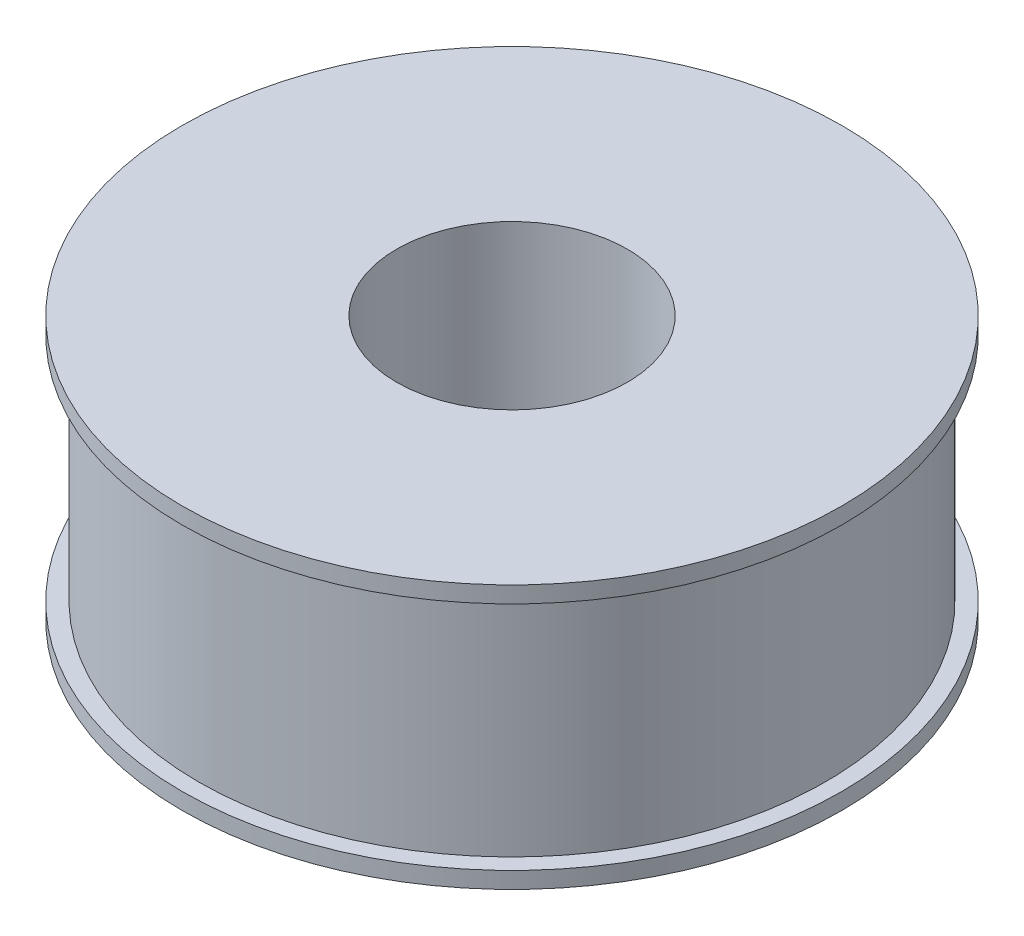
ISO-10303-21;
HEADER;
FILE_DESCRIPTION(('STEP AP214'),'2;1');
FILE_NAME('part.step','',(''),(''),'','','');
FILE_SCHEMA(('AUTOMOTIVE_DESIGN { 1 0 10303 214 1 1 1 1 }'));
ENDSEC;
DATA;
#1=APPLICATION_CONTEXT('core data for automotive mechanical design processes');
#2=APPLICATION_PROTOCOL_DEFINITION('international standard','automotive_design',2000,#1);
#3=PRODUCT_CONTEXT('',#1,'mechanical');
#4=PRODUCT('Part','Part','',(#3));
#5=PRODUCT_RELATED_PRODUCT_CATEGORY('part','',(#4));
#6=PRODUCT_DEFINITION_FORMATION('','',#4);
#7=PRODUCT_DEFINITION_CONTEXT('part definition',#1,'design');
#8=PRODUCT_DEFINITION('design','',#6,#7);
#9=PRODUCT_DEFINITION_SHAPE('','',#8);
#10=(LENGTH_UNIT() NAMED_UNIT(*) SI_UNIT(.MILLI.,.METRE.));
#11=(NAMED_UNIT(*) PLANE_ANGLE_UNIT() SI_UNIT($,.RADIAN.));
#12=(NAMED_UNIT(*) SI_UNIT($,.STERADIAN.) SOLID_ANGLE_UNIT());
#13=UNCERTAINTY_MEASURE_WITH_UNIT(LENGTH_MEASURE(1.E-05),#10,'distance_accuracy_value','');
#14=(GEOMETRIC_REPRESENTATION_CONTEXT(3) GLOBAL_UNCERTAINTY_ASSIGNED_CONTEXT((#13)) GLOBAL_UNIT_ASSIGNED_CONTEXT((#10,
#11,#12)) REPRESENTATION_CONTEXT('',''));
#15=CARTESIAN_POINT('',(0.,0.,0.));
#16=DIRECTION('',(0.,0.,1.));
#17=DIRECTION('',(1.,0.,0.));
#18=AXIS2_PLACEMENT_3D('',#15,#16,#17);
#19=CARTESIAN_POINT('',(0.,8.,0.));
#20=DIRECTION('',(0.,-1.,0.));
#21=DIRECTION('',(0.,0.,-1.));
#22=AXIS2_PLACEMENT_3D('',#19,#20,#21);
#23=CYLINDRICAL_SURFACE('',#22,10.);
#24=CARTESIAN_POINT('',(0.,0.5,0.));
#25=DIRECTION('',(0.,-1.,0.));
#26=DIRECTION('',(0.,0.,-1.));
#27=AXIS2_PLACEMENT_3D('',#24,#25,#26);
#28=CIRCLE('',#27,10.);
#29=CARTESIAN_POINT('',(0.,0.5,-10.));
#30=VERTEX_POINT('',#29);
#31=EDGE_CURVE('E47',#30,#30,#28,.T.);
#32=ORIENTED_EDGE('',*,*,#31,.T.);
#33=EDGE_LOOP('',(#32));
#34=FACE_BOUND('',#33,.T.);
#35=CARTESIAN_POINT('',(0.,0.,0.));
#36=DIRECTION('',(0.,1.,0.));
#37=DIRECTION('',(0.,0.,1.));
#38=AXIS2_PLACEMENT_3D('',#35,#36,#37);
#39=CIRCLE('',#38,10.);
#40=CARTESIAN_POINT('',(0.,0.,10.));
#41=VERTEX_POINT('',#40);
#42=EDGE_CURVE('E52',#41,#41,#39,.T.);
#43=ORIENTED_EDGE('',*,*,#42,.T.);
#44=EDGE_LOOP('',(#43));
#45=FACE_BOUND('',#44,.T.);
#46=ADVANCED_FACE('F43',(#34,#45),#23,.T.);
#47=CARTESIAN_POINT('',(0.,8.,0.));
#48=DIRECTION('',(0.,1.,0.));
#49=DIRECTION('',(0.,0.,1.));
#50=AXIS2_PLACEMENT_3D('',#47,#48,#49);
#51=PLANE('',#50);
#52=CARTESIAN_POINT('',(0.,8.,0.));
#53=DIRECTION('',(0.,1.,0.));
#54=DIRECTION('',(0.,0.,1.));
#55=AXIS2_PLACEMENT_3D('',#52,#53,#54);
#56=CIRCLE('',#55,10.);
#57=CARTESIAN_POINT('',(0.,8.,10.));
#58=VERTEX_POINT('',#57);
#59=EDGE_CURVE('E10',#58,#58,#56,.T.);
#60=ORIENTED_EDGE('',*,*,#59,.T.);
#61=EDGE_LOOP('',(#60));
#62=FACE_BOUND('',#61,.T.);
#63=CARTESIAN_POINT('',(0.,8.,0.));
#64=DIRECTION('',(0.,1.,0.));
#65=DIRECTION('',(0.,0.,1.));
#66=AXIS2_PLACEMENT_3D('',#63,#64,#65);
#67=CIRCLE('',#66,3.5);
#68=CARTESIAN_POINT('',(0.,8.,3.5));
#69=VERTEX_POINT('',#68);
#70=EDGE_CURVE('E58',#69,#69,#67,.T.);
#71=ORIENTED_EDGE('',*,*,#70,.F.);
#72=EDGE_LOOP('',(#71));
#73=FACE_BOUND('',#72,.T.);
#74=ADVANCED_FACE('F105',(#62,#73),#51,.T.);
#75=CARTESIAN_POINT('',(0.,0.,0.));
#76=DIRECTION('',(0.,1.,0.));
#77=DIRECTION('',(0.,0.,1.));
#78=AXIS2_PLACEMENT_3D('',#75,#76,#77);
#79=PLANE('',#78);
#80=ORIENTED_EDGE('',*,*,#42,.F.);
#81=EDGE_LOOP('',(#80));
#82=FACE_BOUND('',#81,.T.);
#83=CARTESIAN_POINT('',(0.,0.,0.));
#84=DIRECTION('',(0.,1.,0.));
#85=DIRECTION('',(0.,0.,1.));
#86=AXIS2_PLACEMENT_3D('',#83,#84,#85);
#87=CIRCLE('',#86,3.5);
#88=CARTESIAN_POINT('',(0.,0.,3.5));
#89=VERTEX_POINT('',#88);
#90=EDGE_CURVE('E61',#89,#89,#87,.T.);
#91=ORIENTED_EDGE('',*,*,#90,.T.);
#92=EDGE_LOOP('',(#91));
#93=FACE_BOUND('',#92,.T.);
#94=ADVANCED_FACE('F88',(#82,#93),#79,.F.);
#95=CARTESIAN_POINT('',(0.,7.5,0.));
#96=DIRECTION('',(0.,1.,0.));
#97=DIRECTION('',(0.,0.,1.));
#98=AXIS2_PLACEMENT_3D('',#95,#96,#97);
#99=CIRCLE('',#98,10.);
#100=CARTESIAN_POINT('',(0.,7.5,10.));
#101=VERTEX_POINT('',#100);
#102=EDGE_CURVE('E63',#101,#101,#99,.T.);
#103=ORIENTED_EDGE('',*,*,#102,.T.);
#104=EDGE_LOOP('',(#103));
#105=FACE_BOUND('',#104,.T.);
#106=ORIENTED_EDGE('',*,*,#59,.F.);
#107=EDGE_LOOP('',(#106));
#108=FACE_BOUND('',#107,.T.);
#109=ADVANCED_FACE('F45',(#105,#108),#23,.T.);
#110=CARTESIAN_POINT('',(0.,8.,0.));
#111=DIRECTION('',(0.,-1.,0.));
#112=DIRECTION('',(0.,0.,-1.));
#113=AXIS2_PLACEMENT_3D('',#110,#111,#112);
#114=CYLINDRICAL_SURFACE('',#113,3.5);
#115=ORIENTED_EDGE('',*,*,#70,.T.);
#116=EDGE_LOOP('',(#115));
#117=FACE_BOUND('',#116,.T.);
#118=ORIENTED_EDGE('',*,*,#90,.F.);
#119=EDGE_LOOP('',(#118));
#120=FACE_BOUND('',#119,.T.);
#121=ADVANCED_FACE('F90',(#117,#120),#114,.F.);
#122=CARTESIAN_POINT('',(-10.5,0.500000000000001,0.));
#123=DIRECTION('',(0.,-1.,0.));
#124=DIRECTION('',(0.,0.,-1.));
#125=AXIS2_PLACEMENT_3D('',#122,#123,#124);
#126=PLANE('',#125);
#127=CARTESIAN_POINT('',(0.,0.5,0.));
#128=DIRECTION('',(0.,1.,0.));
#129=DIRECTION('',(0.,0.,1.));
#130=AXIS2_PLACEMENT_3D('',#127,#128,#129);
#131=CIRCLE('',#130,9.5);
#132=CARTESIAN_POINT('',(0.,0.5,9.5));
#133=VERTEX_POINT('',#132);
#134=EDGE_CURVE('E66',#133,#133,#131,.T.);
#135=ORIENTED_EDGE('',*,*,#134,.F.);
#136=EDGE_LOOP('',(#135));
#137=FACE_BOUND('',#136,.T.);
#138=ORIENTED_EDGE('',*,*,#31,.F.);
#139=EDGE_LOOP('',(#138));
#140=FACE_BOUND('',#139,.T.);
#141=ADVANCED_FACE('F92',(#137,#140),#126,.F.);
#142=CARTESIAN_POINT('',(-10.5,7.5,0.));
#143=DIRECTION('',(0.,1.,0.));
#144=DIRECTION('',(0.,0.,1.));
#145=AXIS2_PLACEMENT_3D('',#142,#143,#144);
#146=PLANE('',#145);
#147=CARTESIAN_POINT('',(0.,7.5,0.));
#148=DIRECTION('',(0.,1.,0.));
#149=DIRECTION('',(0.,0.,1.));
#150=AXIS2_PLACEMENT_3D('',#147,#148,#149);
#151=CIRCLE('',#150,9.5);
#152=CARTESIAN_POINT('',(0.,7.5,9.5));
#153=VERTEX_POINT('',#152);
#154=EDGE_CURVE('E73',#153,#153,#151,.T.);
#155=ORIENTED_EDGE('',*,*,#154,.T.);
#156=EDGE_LOOP('',(#155));
#157=FACE_BOUND('',#156,.T.);
#158=ORIENTED_EDGE('',*,*,#102,.F.);
#159=EDGE_LOOP('',(#158));
#160=FACE_BOUND('',#159,.T.);
#161=ADVANCED_FACE('F99',(#157,#160),#146,.F.);
#162=CARTESIAN_POINT('',(0.,8.,0.));
#163=DIRECTION('',(0.,1.,0.));
#164=DIRECTION('',(0.,0.,1.));
#165=AXIS2_PLACEMENT_3D('',#162,#163,#164);
#166=CYLINDRICAL_SURFACE('',#165,9.5);
#167=ORIENTED_EDGE('',*,*,#154,.F.);
#168=EDGE_LOOP('',(#167));
#169=FACE_BOUND('',#168,.T.);
#170=ORIENTED_EDGE('',*,*,#134,.T.);
#171=EDGE_LOOP('',(#170));
#172=FACE_BOUND('',#171,.T.);
#173=ADVANCED_FACE('F149',(#169,#172),#166,.T.);
#174=CLOSED_SHELL('',(#46,#74,#94,#109,#121,#141,#161,#173));
#175=MANIFOLD_SOLID_BREP('B2',#174);
#176=ADVANCED_BREP_SHAPE_REPRESENTATION('',(#18,#175),#14);
#177=SHAPE_DEFINITION_REPRESENTATION(#9,#176);
ENDSEC;
END-ISO-10303-21;
